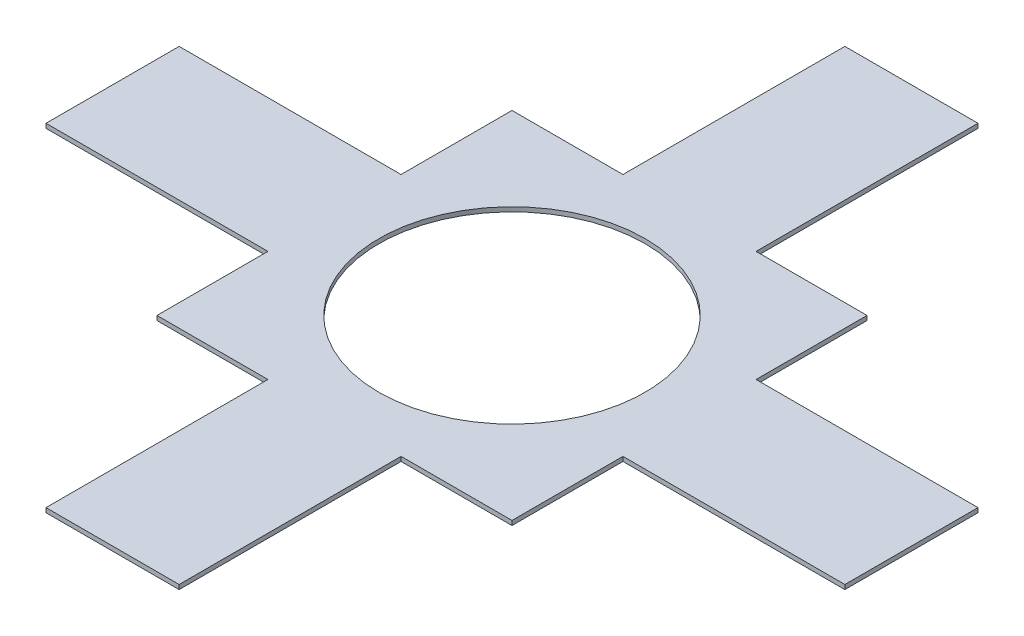
ISO-10303-21;
HEADER;
FILE_DESCRIPTION(('STEP AP214'),'2;1');
FILE_NAME('part.step','',(''),(''),'','','');
FILE_SCHEMA(('AUTOMOTIVE_DESIGN { 1 0 10303 214 1 1 1 1 }'));
ENDSEC;
DATA;
#1=APPLICATION_CONTEXT('core data for automotive mechanical design processes');
#2=APPLICATION_PROTOCOL_DEFINITION('international standard','automotive_design',2000,#1);
#3=PRODUCT_CONTEXT('',#1,'mechanical');
#4=PRODUCT('Part','Part','',(#3));
#5=PRODUCT_RELATED_PRODUCT_CATEGORY('part','',(#4));
#6=PRODUCT_DEFINITION_FORMATION('','',#4);
#7=PRODUCT_DEFINITION_CONTEXT('part definition',#1,'design');
#8=PRODUCT_DEFINITION('design','',#6,#7);
#9=PRODUCT_DEFINITION_SHAPE('','',#8);
#10=(LENGTH_UNIT() NAMED_UNIT(*) SI_UNIT(.MILLI.,.METRE.));
#11=(NAMED_UNIT(*) PLANE_ANGLE_UNIT() SI_UNIT($,.RADIAN.));
#12=(NAMED_UNIT(*) SI_UNIT($,.STERADIAN.) SOLID_ANGLE_UNIT());
#13=UNCERTAINTY_MEASURE_WITH_UNIT(LENGTH_MEASURE(1.E-05),#10,'distance_accuracy_value','');
#14=(GEOMETRIC_REPRESENTATION_CONTEXT(3) GLOBAL_UNCERTAINTY_ASSIGNED_CONTEXT((#13)) GLOBAL_UNIT_ASSIGNED_CONTEXT((#10,
#11,#12)) REPRESENTATION_CONTEXT('',''));
#15=CARTESIAN_POINT('',(0.,0.,0.));
#16=DIRECTION('',(0.,0.,1.));
#17=DIRECTION('',(1.,0.,0.));
#18=AXIS2_PLACEMENT_3D('',#15,#16,#17);
#19=CARTESIAN_POINT('',(0.,0.1,0.));
#20=DIRECTION('',(0.,1.,0.));
#21=DIRECTION('',(0.,0.,1.));
#22=AXIS2_PLACEMENT_3D('',#19,#20,#21);
#23=PLANE('',#22);
#24=DIRECTION('',(0.,0.,1.));
#25=VECTOR('',#24,1.);
#26=CARTESIAN_POINT('',(-3.99999999999913,0.1,-4.));
#27=LINE('',#26,#25);
#28=CARTESIAN_POINT('',(-3.99999999999913,0.1,-4.));
#29=VERTEX_POINT('',#28);
#30=CARTESIAN_POINT('',(-3.99999999999913,0.1,-1.50000000000023));
#31=VERTEX_POINT('',#30);
#32=EDGE_CURVE('E247',#29,#31,#27,.T.);
#33=ORIENTED_EDGE('',*,*,#32,.T.);
#34=DIRECTION('',(-1.,0.,0.));
#35=VECTOR('',#34,1.);
#36=CARTESIAN_POINT('',(-8.99999999999946,0.1,-1.50000000000022));
#37=LINE('',#36,#35);
#38=CARTESIAN_POINT('',(-8.99999999999946,0.1,-1.50000000000022));
#39=VERTEX_POINT('',#38);
#40=EDGE_CURVE('E135',#31,#39,#37,.T.);
#41=ORIENTED_EDGE('',*,*,#40,.T.);
#42=DIRECTION('',(0.,0.,1.));
#43=VECTOR('',#42,1.);
#44=CARTESIAN_POINT('',(-8.99999999999946,0.1,1.50000000000006));
#45=LINE('',#44,#43);
#46=CARTESIAN_POINT('',(-8.99999999999946,0.1,1.50000000000006));
#47=VERTEX_POINT('',#46);
#48=EDGE_CURVE('E298',#39,#47,#45,.T.);
#49=ORIENTED_EDGE('',*,*,#48,.T.);
#50=DIRECTION('',(1.,0.,0.));
#51=VECTOR('',#50,1.);
#52=CARTESIAN_POINT('',(-3.99999999999913,0.1,1.50000000000006));
#53=LINE('',#52,#51);
#54=CARTESIAN_POINT('',(-3.99999999999913,0.1,1.50000000000006));
#55=VERTEX_POINT('',#54);
#56=EDGE_CURVE('E317',#47,#55,#53,.T.);
#57=ORIENTED_EDGE('',*,*,#56,.T.);
#58=DIRECTION('',(0.,0.,1.));
#59=VECTOR('',#58,1.);
#60=CARTESIAN_POINT('',(-3.99999999999913,0.1,1.50000000000006));
#61=LINE('',#60,#59);
#62=CARTESIAN_POINT('',(-3.99999999999913,0.1,3.99999999999981));
#63=VERTEX_POINT('',#62);
#64=EDGE_CURVE('E314',#55,#63,#61,.T.);
#65=ORIENTED_EDGE('',*,*,#64,.T.);
#66=DIRECTION('',(1.,0.,0.));
#67=VECTOR('',#66,1.);
#68=CARTESIAN_POINT('',(-3.99999999999913,0.1,3.99999999999981));
#69=LINE('',#68,#67);
#70=CARTESIAN_POINT('',(-1.49999999999921,0.1,3.99999999999971));
#71=VERTEX_POINT('',#70);
#72=EDGE_CURVE('E316',#63,#71,#69,.T.);
#73=ORIENTED_EDGE('',*,*,#72,.T.);
#74=DIRECTION('',(0.,0.,1.));
#75=VECTOR('',#74,1.);
#76=CARTESIAN_POINT('',(-1.49999999999921,0.1,8.99999999999753));
#77=LINE('',#76,#75);
#78=CARTESIAN_POINT('',(-1.49999999999921,0.1,8.99999999999753));
#79=VERTEX_POINT('',#78);
#80=EDGE_CURVE('E319',#71,#79,#77,.T.);
#81=ORIENTED_EDGE('',*,*,#80,.T.);
#82=DIRECTION('',(1.,0.,0.));
#83=VECTOR('',#82,1.);
#84=CARTESIAN_POINT('',(1.5000000000008,0.1,8.9999999999976));
#85=LINE('',#84,#83);
#86=CARTESIAN_POINT('',(1.5000000000008,0.1,8.9999999999976));
#87=VERTEX_POINT('',#86);
#88=EDGE_CURVE('E325',#79,#87,#85,.T.);
#89=ORIENTED_EDGE('',*,*,#88,.T.);
#90=DIRECTION('',(0.,0.,-1.));
#91=VECTOR('',#90,1.);
#92=CARTESIAN_POINT('',(1.50000000000079,0.1,3.99999999999971));
#93=LINE('',#92,#91);
#94=CARTESIAN_POINT('',(1.50000000000079,0.1,3.99999999999971));
#95=VERTEX_POINT('',#94);
#96=EDGE_CURVE('E327',#87,#95,#93,.T.);
#97=ORIENTED_EDGE('',*,*,#96,.T.);
#98=DIRECTION('',(1.,0.,0.));
#99=VECTOR('',#98,1.);
#100=CARTESIAN_POINT('',(1.50000000000079,0.1,3.99999999999971));
#101=LINE('',#100,#99);
#102=CARTESIAN_POINT('',(4.00000000000025,0.1,3.99999999999981));
#103=VERTEX_POINT('',#102);
#104=EDGE_CURVE('E329',#95,#103,#101,.T.);
#105=ORIENTED_EDGE('',*,*,#104,.T.);
#106=DIRECTION('',(0.,0.,-1.));
#107=VECTOR('',#106,1.);
#108=CARTESIAN_POINT('',(4.00000000000025,0.1,1.50000000000082));
#109=LINE('',#108,#107);
#110=CARTESIAN_POINT('',(4.00000000000025,0.1,1.50000000000082));
#111=VERTEX_POINT('',#110);
#112=EDGE_CURVE('E331',#103,#111,#109,.T.);
#113=ORIENTED_EDGE('',*,*,#112,.T.);
#114=DIRECTION('',(1.,0.,0.));
#115=VECTOR('',#114,1.);
#116=CARTESIAN_POINT('',(9.00000000000025,0.1,1.50000000000082));
#117=LINE('',#116,#115);
#118=CARTESIAN_POINT('',(9.00000000000025,0.1,1.50000000000082));
#119=VERTEX_POINT('',#118);
#120=EDGE_CURVE('E333',#111,#119,#117,.T.);
#121=ORIENTED_EDGE('',*,*,#120,.T.);
#122=DIRECTION('',(0.,0.,-1.));
#123=VECTOR('',#122,1.);
#124=CARTESIAN_POINT('',(9.00000000000025,0.1,-1.50000000000052));
#125=LINE('',#124,#123);
#126=CARTESIAN_POINT('',(9.00000000000025,0.1,-1.50000000000052));
#127=VERTEX_POINT('',#126);
#128=EDGE_CURVE('E335',#119,#127,#125,.T.);
#129=ORIENTED_EDGE('',*,*,#128,.T.);
#130=DIRECTION('',(-1.,0.,0.));
#131=VECTOR('',#130,1.);
#132=CARTESIAN_POINT('',(4.00000000000025,0.1,-1.50000000000054));
#133=LINE('',#132,#131);
#134=CARTESIAN_POINT('',(4.00000000000025,0.1,-1.50000000000054));
#135=VERTEX_POINT('',#134);
#136=EDGE_CURVE('E337',#127,#135,#133,.T.);
#137=ORIENTED_EDGE('',*,*,#136,.T.);
#138=DIRECTION('',(0.,0.,-1.));
#139=VECTOR('',#138,1.);
#140=CARTESIAN_POINT('',(4.00000000000025,0.1,-4.));
#141=LINE('',#140,#139);
#142=CARTESIAN_POINT('',(4.00000000000025,0.1,-4.));
#143=VERTEX_POINT('',#142);
#144=EDGE_CURVE('E339',#135,#143,#141,.T.);
#145=ORIENTED_EDGE('',*,*,#144,.T.);
#146=DIRECTION('',(-1.,0.,0.));
#147=VECTOR('',#146,1.);
#148=CARTESIAN_POINT('',(1.50000000000087,0.1,-4.));
#149=LINE('',#148,#147);
#150=CARTESIAN_POINT('',(1.50000000000087,0.1,-4.));
#151=VERTEX_POINT('',#150);
#152=EDGE_CURVE('E341',#143,#151,#149,.T.);
#153=ORIENTED_EDGE('',*,*,#152,.T.);
#154=DIRECTION('',(0.,0.,-1.));
#155=VECTOR('',#154,1.);
#156=CARTESIAN_POINT('',(1.50000000000087,0.1,-9.));
#157=LINE('',#156,#155);
#158=CARTESIAN_POINT('',(1.50000000000087,0.1,-9.));
#159=VERTEX_POINT('',#158);
#160=EDGE_CURVE('E190',#151,#159,#157,.T.);
#161=ORIENTED_EDGE('',*,*,#160,.T.);
#162=DIRECTION('',(-1.,0.,0.));
#163=VECTOR('',#162,1.);
#164=CARTESIAN_POINT('',(-1.49999999999913,0.1,-9.));
#165=LINE('',#164,#163);
#166=CARTESIAN_POINT('',(-1.49999999999913,0.1,-9.));
#167=VERTEX_POINT('',#166);
#168=EDGE_CURVE('E184',#159,#167,#165,.T.);
#169=ORIENTED_EDGE('',*,*,#168,.T.);
#170=DIRECTION('',(0.,0.,1.));
#171=VECTOR('',#170,1.);
#172=CARTESIAN_POINT('',(-1.49999999999913,0.1,-4.));
#173=LINE('',#172,#171);
#174=CARTESIAN_POINT('',(-1.49999999999913,0.1,-4.));
#175=VERTEX_POINT('',#174);
#176=EDGE_CURVE('E188',#167,#175,#173,.T.);
#177=ORIENTED_EDGE('',*,*,#176,.T.);
#178=DIRECTION('',(-1.,0.,0.));
#179=VECTOR('',#178,1.);
#180=CARTESIAN_POINT('',(-3.99999999999913,0.1,-4.));
#181=LINE('',#180,#179);
#182=EDGE_CURVE('E56',#175,#29,#181,.T.);
#183=ORIENTED_EDGE('',*,*,#182,.T.);
#184=EDGE_LOOP('',(#33,#41,#49,#57,#65,#73,#81,#89,#97,#105,#113,#121,#129,#137,#145,#153,#161,
#169,#177,#183));
#185=FACE_BOUND('',#184,.T.);
#186=CARTESIAN_POINT('',(0.,0.1,0.));
#187=DIRECTION('',(0.,1.,0.));
#188=DIRECTION('',(0.,0.,1.));
#189=AXIS2_PLACEMENT_3D('',#186,#187,#188);
#190=CIRCLE('',#189,3.);
#191=CARTESIAN_POINT('',(0.,0.1,3.));
#192=VERTEX_POINT('',#191);
#193=EDGE_CURVE('E212',#192,#192,#190,.T.);
#194=ORIENTED_EDGE('',*,*,#193,.F.);
#195=EDGE_LOOP('',(#194));
#196=FACE_BOUND('',#195,.T.);
#197=ADVANCED_FACE('F39',(#185,#196),#23,.T.);
#198=CARTESIAN_POINT('',(0.,0.,0.));
#199=DIRECTION('',(0.,1.,0.));
#200=DIRECTION('',(0.,0.,1.));
#201=AXIS2_PLACEMENT_3D('',#198,#199,#200);
#202=PLANE('',#201);
#203=DIRECTION('',(0.,0.,1.));
#204=VECTOR('',#203,1.);
#205=CARTESIAN_POINT('',(-3.99999999999913,0.,-4.));
#206=LINE('',#205,#204);
#207=CARTESIAN_POINT('',(-3.99999999999913,0.,-4.));
#208=VERTEX_POINT('',#207);
#209=CARTESIAN_POINT('',(-3.99999999999913,0.,-1.50000000000023));
#210=VERTEX_POINT('',#209);
#211=EDGE_CURVE('E208',#208,#210,#206,.T.);
#212=ORIENTED_EDGE('',*,*,#211,.F.);
#213=DIRECTION('',(-1.,0.,0.));
#214=VECTOR('',#213,1.);
#215=CARTESIAN_POINT('',(-3.99999999999913,0.,-4.));
#216=LINE('',#215,#214);
#217=CARTESIAN_POINT('',(-1.49999999999913,0.,-4.));
#218=VERTEX_POINT('',#217);
#219=EDGE_CURVE('E127',#218,#208,#216,.T.);
#220=ORIENTED_EDGE('',*,*,#219,.F.);
#221=DIRECTION('',(0.,0.,1.));
#222=VECTOR('',#221,1.);
#223=CARTESIAN_POINT('',(-1.49999999999913,0.,-4.));
#224=LINE('',#223,#222);
#225=CARTESIAN_POINT('',(-1.49999999999913,0.,-9.));
#226=VERTEX_POINT('',#225);
#227=EDGE_CURVE('E121',#226,#218,#224,.T.);
#228=ORIENTED_EDGE('',*,*,#227,.F.);
#229=DIRECTION('',(-1.,0.,0.));
#230=VECTOR('',#229,1.);
#231=CARTESIAN_POINT('',(-1.49999999999913,0.,-9.));
#232=LINE('',#231,#230);
#233=CARTESIAN_POINT('',(1.50000000000087,0.,-9.));
#234=VERTEX_POINT('',#233);
#235=EDGE_CURVE('E198',#234,#226,#232,.T.);
#236=ORIENTED_EDGE('',*,*,#235,.F.);
#237=DIRECTION('',(0.,0.,-1.));
#238=VECTOR('',#237,1.);
#239=CARTESIAN_POINT('',(1.50000000000087,0.,-9.));
#240=LINE('',#239,#238);
#241=CARTESIAN_POINT('',(1.50000000000087,0.,-4.));
#242=VERTEX_POINT('',#241);
#243=EDGE_CURVE('E242',#242,#234,#240,.T.);
#244=ORIENTED_EDGE('',*,*,#243,.F.);
#245=DIRECTION('',(-1.,0.,0.));
#246=VECTOR('',#245,1.);
#247=CARTESIAN_POINT('',(1.50000000000087,0.,-4.));
#248=LINE('',#247,#246);
#249=CARTESIAN_POINT('',(4.00000000000025,0.,-4.));
#250=VERTEX_POINT('',#249);
#251=EDGE_CURVE('E240',#250,#242,#248,.T.);
#252=ORIENTED_EDGE('',*,*,#251,.F.);
#253=DIRECTION('',(0.,0.,-1.));
#254=VECTOR('',#253,1.);
#255=CARTESIAN_POINT('',(4.00000000000025,0.,-4.));
#256=LINE('',#255,#254);
#257=CARTESIAN_POINT('',(4.00000000000025,0.,-1.50000000000054));
#258=VERTEX_POINT('',#257);
#259=EDGE_CURVE('E238',#258,#250,#256,.T.);
#260=ORIENTED_EDGE('',*,*,#259,.F.);
#261=DIRECTION('',(-1.,0.,0.));
#262=VECTOR('',#261,1.);
#263=CARTESIAN_POINT('',(4.00000000000025,0.,-1.50000000000054));
#264=LINE('',#263,#262);
#265=CARTESIAN_POINT('',(9.00000000000025,0.,-1.50000000000052));
#266=VERTEX_POINT('',#265);
#267=EDGE_CURVE('E236',#266,#258,#264,.T.);
#268=ORIENTED_EDGE('',*,*,#267,.F.);
#269=DIRECTION('',(0.,0.,-1.));
#270=VECTOR('',#269,1.);
#271=CARTESIAN_POINT('',(9.00000000000025,0.,-1.50000000000052));
#272=LINE('',#271,#270);
#273=CARTESIAN_POINT('',(9.00000000000025,0.,1.50000000000082));
#274=VERTEX_POINT('',#273);
#275=EDGE_CURVE('E234',#274,#266,#272,.T.);
#276=ORIENTED_EDGE('',*,*,#275,.F.);
#277=DIRECTION('',(1.,0.,0.));
#278=VECTOR('',#277,1.);
#279=CARTESIAN_POINT('',(9.00000000000025,0.,1.50000000000082));
#280=LINE('',#279,#278);
#281=CARTESIAN_POINT('',(4.00000000000025,0.,1.50000000000082));
#282=VERTEX_POINT('',#281);
#283=EDGE_CURVE('E232',#282,#274,#280,.T.);
#284=ORIENTED_EDGE('',*,*,#283,.F.);
#285=DIRECTION('',(0.,0.,-1.));
#286=VECTOR('',#285,1.);
#287=CARTESIAN_POINT('',(4.00000000000025,0.,1.50000000000082));
#288=LINE('',#287,#286);
#289=CARTESIAN_POINT('',(4.00000000000025,0.,3.99999999999981));
#290=VERTEX_POINT('',#289);
#291=EDGE_CURVE('E230',#290,#282,#288,.T.);
#292=ORIENTED_EDGE('',*,*,#291,.F.);
#293=DIRECTION('',(1.,0.,0.));
#294=VECTOR('',#293,1.);
#295=CARTESIAN_POINT('',(1.50000000000079,0.,3.99999999999971));
#296=LINE('',#295,#294);
#297=CARTESIAN_POINT('',(1.50000000000079,0.,3.99999999999971));
#298=VERTEX_POINT('',#297);
#299=EDGE_CURVE('E228',#298,#290,#296,.T.);
#300=ORIENTED_EDGE('',*,*,#299,.F.);
#301=DIRECTION('',(0.,0.,-1.));
#302=VECTOR('',#301,1.);
#303=CARTESIAN_POINT('',(1.50000000000079,0.,3.99999999999971));
#304=LINE('',#303,#302);
#305=CARTESIAN_POINT('',(1.5000000000008,0.,8.9999999999976));
#306=VERTEX_POINT('',#305);
#307=EDGE_CURVE('E226',#306,#298,#304,.T.);
#308=ORIENTED_EDGE('',*,*,#307,.F.);
#309=DIRECTION('',(1.,0.,0.));
#310=VECTOR('',#309,1.);
#311=CARTESIAN_POINT('',(1.5000000000008,0.,8.9999999999976));
#312=LINE('',#311,#310);
#313=CARTESIAN_POINT('',(-1.49999999999921,0.,8.99999999999753));
#314=VERTEX_POINT('',#313);
#315=EDGE_CURVE('E224',#314,#306,#312,.T.);
#316=ORIENTED_EDGE('',*,*,#315,.F.);
#317=DIRECTION('',(0.,0.,1.));
#318=VECTOR('',#317,1.);
#319=CARTESIAN_POINT('',(-1.49999999999921,0.,8.99999999999753));
#320=LINE('',#319,#318);
#321=CARTESIAN_POINT('',(-1.49999999999921,0.,3.99999999999971));
#322=VERTEX_POINT('',#321);
#323=EDGE_CURVE('E222',#322,#314,#320,.T.);
#324=ORIENTED_EDGE('',*,*,#323,.F.);
#325=DIRECTION('',(1.,0.,0.));
#326=VECTOR('',#325,1.);
#327=CARTESIAN_POINT('',(-3.99999999999913,0.,3.99999999999981));
#328=LINE('',#327,#326);
#329=CARTESIAN_POINT('',(-3.99999999999913,0.,3.99999999999981));
#330=VERTEX_POINT('',#329);
#331=EDGE_CURVE('E220',#330,#322,#328,.T.);
#332=ORIENTED_EDGE('',*,*,#331,.F.);
#333=DIRECTION('',(0.,0.,1.));
#334=VECTOR('',#333,1.);
#335=CARTESIAN_POINT('',(-3.99999999999913,0.,1.50000000000006));
#336=LINE('',#335,#334);
#337=CARTESIAN_POINT('',(-3.99999999999913,0.,1.50000000000006));
#338=VERTEX_POINT('',#337);
#339=EDGE_CURVE('E218',#338,#330,#336,.T.);
#340=ORIENTED_EDGE('',*,*,#339,.F.);
#341=DIRECTION('',(1.,0.,0.));
#342=VECTOR('',#341,1.);
#343=CARTESIAN_POINT('',(-3.99999999999913,0.,1.50000000000006));
#344=LINE('',#343,#342);
#345=CARTESIAN_POINT('',(-8.99999999999946,0.,1.50000000000006));
#346=VERTEX_POINT('',#345);
#347=EDGE_CURVE('E216',#346,#338,#344,.T.);
#348=ORIENTED_EDGE('',*,*,#347,.F.);
#349=DIRECTION('',(0.,0.,1.));
#350=VECTOR('',#349,1.);
#351=CARTESIAN_POINT('',(-8.99999999999946,0.,1.50000000000006));
#352=LINE('',#351,#350);
#353=CARTESIAN_POINT('',(-8.99999999999946,0.,-1.50000000000022));
#354=VERTEX_POINT('',#353);
#355=EDGE_CURVE('E214',#354,#346,#352,.T.);
#356=ORIENTED_EDGE('',*,*,#355,.F.);
#357=DIRECTION('',(-1.,0.,0.));
#358=VECTOR('',#357,1.);
#359=CARTESIAN_POINT('',(-8.99999999999946,0.,-1.50000000000022));
#360=LINE('',#359,#358);
#361=EDGE_CURVE('E211',#210,#354,#360,.T.);
#362=ORIENTED_EDGE('',*,*,#361,.F.);
#363=EDGE_LOOP('',(#212,#220,#228,#236,#244,#252,#260,#268,#276,#284,#292,#300,#308,#316,#324,
#332,#340,#348,#356,#362));
#364=FACE_BOUND('',#363,.T.);
#365=CARTESIAN_POINT('',(0.,0.,0.));
#366=DIRECTION('',(0.,1.,0.));
#367=DIRECTION('',(0.,0.,1.));
#368=AXIS2_PLACEMENT_3D('',#365,#366,#367);
#369=CIRCLE('',#368,3.);
#370=CARTESIAN_POINT('',(0.,0.,3.));
#371=VERTEX_POINT('',#370);
#372=EDGE_CURVE('E594',#371,#371,#369,.T.);
#373=ORIENTED_EDGE('',*,*,#372,.T.);
#374=EDGE_LOOP('',(#373));
#375=FACE_BOUND('',#374,.T.);
#376=ADVANCED_FACE('F302',(#364,#375),#202,.F.);
#377=CARTESIAN_POINT('',(-3.99999999999913,0.1,-4.));
#378=DIRECTION('',(1.,0.,0.));
#379=DIRECTION('',(0.,0.,-1.));
#380=AXIS2_PLACEMENT_3D('',#377,#378,#379);
#381=PLANE('',#380);
#382=ORIENTED_EDGE('',*,*,#211,.T.);
#383=DIRECTION('',(0.,-1.,0.));
#384=VECTOR('',#383,1.);
#385=CARTESIAN_POINT('',(-3.99999999999913,0.1,-1.50000000000023));
#386=LINE('',#385,#384);
#387=EDGE_CURVE('E11',#31,#210,#386,.T.);
#388=ORIENTED_EDGE('',*,*,#387,.F.);
#389=ORIENTED_EDGE('',*,*,#32,.F.);
#390=DIRECTION('',(0.,-1.,0.));
#391=VECTOR('',#390,1.);
#392=CARTESIAN_POINT('',(-3.99999999999913,0.1,-4.));
#393=LINE('',#392,#391);
#394=EDGE_CURVE('E204',#29,#208,#393,.T.);
#395=ORIENTED_EDGE('',*,*,#394,.T.);
#396=EDGE_LOOP('',(#382,#388,#389,#395));
#397=FACE_BOUND('',#396,.T.);
#398=ADVANCED_FACE('F41',(#397),#381,.F.);
#399=CARTESIAN_POINT('',(-8.99999999999946,0.1,-1.50000000000022));
#400=DIRECTION('',(0.,0.,1.));
#401=DIRECTION('',(1.,0.,0.));
#402=AXIS2_PLACEMENT_3D('',#399,#400,#401);
#403=PLANE('',#402);
#404=ORIENTED_EDGE('',*,*,#361,.T.);
#405=DIRECTION('',(0.,-1.,0.));
#406=VECTOR('',#405,1.);
#407=CARTESIAN_POINT('',(-8.99999999999946,0.1,-1.50000000000022));
#408=LINE('',#407,#406);
#409=EDGE_CURVE('E48',#39,#354,#408,.T.);
#410=ORIENTED_EDGE('',*,*,#409,.F.);
#411=ORIENTED_EDGE('',*,*,#40,.F.);
#412=ORIENTED_EDGE('',*,*,#387,.T.);
#413=EDGE_LOOP('',(#404,#410,#411,#412));
#414=FACE_BOUND('',#413,.T.);
#415=ADVANCED_FACE('F375',(#414),#403,.F.);
#416=CARTESIAN_POINT('',(-8.99999999999946,0.1,1.50000000000006));
#417=DIRECTION('',(1.,0.,0.));
#418=DIRECTION('',(0.,0.,-1.));
#419=AXIS2_PLACEMENT_3D('',#416,#417,#418);
#420=PLANE('',#419);
#421=ORIENTED_EDGE('',*,*,#355,.T.);
#422=DIRECTION('',(0.,-1.,0.));
#423=VECTOR('',#422,1.);
#424=CARTESIAN_POINT('',(-8.99999999999946,0.1,1.50000000000006));
#425=LINE('',#424,#423);
#426=EDGE_CURVE('E290',#47,#346,#425,.T.);
#427=ORIENTED_EDGE('',*,*,#426,.F.);
#428=ORIENTED_EDGE('',*,*,#48,.F.);
#429=ORIENTED_EDGE('',*,*,#409,.T.);
#430=EDGE_LOOP('',(#421,#427,#428,#429));
#431=FACE_BOUND('',#430,.T.);
#432=ADVANCED_FACE('F296',(#431),#420,.F.);
#433=CARTESIAN_POINT('',(-3.99999999999913,0.1,1.50000000000006));
#434=DIRECTION('',(0.,0.,-1.));
#435=DIRECTION('',(-1.,0.,0.));
#436=AXIS2_PLACEMENT_3D('',#433,#434,#435);
#437=PLANE('',#436);
#438=ORIENTED_EDGE('',*,*,#347,.T.);
#439=DIRECTION('',(0.,-1.,0.));
#440=VECTOR('',#439,1.);
#441=CARTESIAN_POINT('',(-3.99999999999913,0.1,1.50000000000006));
#442=LINE('',#441,#440);
#443=EDGE_CURVE('E287',#55,#338,#442,.T.);
#444=ORIENTED_EDGE('',*,*,#443,.F.);
#445=ORIENTED_EDGE('',*,*,#56,.F.);
#446=ORIENTED_EDGE('',*,*,#426,.T.);
#447=EDGE_LOOP('',(#438,#444,#445,#446));
#448=FACE_BOUND('',#447,.T.);
#449=ADVANCED_FACE('F308',(#448),#437,.F.);
#450=CARTESIAN_POINT('',(-3.99999999999913,0.1,1.50000000000006));
#451=DIRECTION('',(1.,0.,0.));
#452=DIRECTION('',(0.,0.,-1.));
#453=AXIS2_PLACEMENT_3D('',#450,#451,#452);
#454=PLANE('',#453);
#455=ORIENTED_EDGE('',*,*,#339,.T.);
#456=DIRECTION('',(0.,-1.,0.));
#457=VECTOR('',#456,1.);
#458=CARTESIAN_POINT('',(-3.99999999999913,0.1,3.99999999999981));
#459=LINE('',#458,#457);
#460=EDGE_CURVE('E284',#63,#330,#459,.T.);
#461=ORIENTED_EDGE('',*,*,#460,.F.);
#462=ORIENTED_EDGE('',*,*,#64,.F.);
#463=ORIENTED_EDGE('',*,*,#443,.T.);
#464=EDGE_LOOP('',(#455,#461,#462,#463));
#465=FACE_BOUND('',#464,.T.);
#466=ADVANCED_FACE('F312',(#465),#454,.F.);
#467=CARTESIAN_POINT('',(-3.99999999999913,0.1,3.99999999999981));
#468=DIRECTION('',(0.,0.,-1.));
#469=DIRECTION('',(-1.,0.,0.));
#470=AXIS2_PLACEMENT_3D('',#467,#468,#469);
#471=PLANE('',#470);
#472=ORIENTED_EDGE('',*,*,#331,.T.);
#473=DIRECTION('',(0.,-1.,0.));
#474=VECTOR('',#473,1.);
#475=CARTESIAN_POINT('',(-1.49999999999921,0.1,3.99999999999971));
#476=LINE('',#475,#474);
#477=EDGE_CURVE('E281',#71,#322,#476,.T.);
#478=ORIENTED_EDGE('',*,*,#477,.F.);
#479=ORIENTED_EDGE('',*,*,#72,.F.);
#480=ORIENTED_EDGE('',*,*,#460,.T.);
#481=EDGE_LOOP('',(#472,#478,#479,#480));
#482=FACE_BOUND('',#481,.T.);
#483=ADVANCED_FACE('F388',(#482),#471,.F.);
#484=CARTESIAN_POINT('',(-1.49999999999921,0.1,8.99999999999753));
#485=DIRECTION('',(1.,0.,0.));
#486=DIRECTION('',(0.,0.,-1.));
#487=AXIS2_PLACEMENT_3D('',#484,#485,#486);
#488=PLANE('',#487);
#489=ORIENTED_EDGE('',*,*,#323,.T.);
#490=DIRECTION('',(0.,-1.,0.));
#491=VECTOR('',#490,1.);
#492=CARTESIAN_POINT('',(-1.49999999999921,0.1,8.99999999999753));
#493=LINE('',#492,#491);
#494=EDGE_CURVE('E278',#79,#314,#493,.T.);
#495=ORIENTED_EDGE('',*,*,#494,.F.);
#496=ORIENTED_EDGE('',*,*,#80,.F.);
#497=ORIENTED_EDGE('',*,*,#477,.T.);
#498=EDGE_LOOP('',(#489,#495,#496,#497));
#499=FACE_BOUND('',#498,.T.);
#500=ADVANCED_FACE('F391',(#499),#488,.F.);
#501=CARTESIAN_POINT('',(1.5000000000008,0.1,8.9999999999976));
#502=DIRECTION('',(0.,0.,-1.));
#503=DIRECTION('',(-1.,0.,0.));
#504=AXIS2_PLACEMENT_3D('',#501,#502,#503);
#505=PLANE('',#504);
#506=ORIENTED_EDGE('',*,*,#315,.T.);
#507=DIRECTION('',(0.,-1.,0.));
#508=VECTOR('',#507,1.);
#509=CARTESIAN_POINT('',(1.5000000000008,0.1,8.9999999999976));
#510=LINE('',#509,#508);
#511=EDGE_CURVE('E275',#87,#306,#510,.T.);
#512=ORIENTED_EDGE('',*,*,#511,.F.);
#513=ORIENTED_EDGE('',*,*,#88,.F.);
#514=ORIENTED_EDGE('',*,*,#494,.T.);
#515=EDGE_LOOP('',(#506,#512,#513,#514));
#516=FACE_BOUND('',#515,.T.);
#517=ADVANCED_FACE('F395',(#516),#505,.F.);
#518=CARTESIAN_POINT('',(1.50000000000079,0.1,3.99999999999971));
#519=DIRECTION('',(-1.,0.,0.));
#520=DIRECTION('',(0.,0.,1.));
#521=AXIS2_PLACEMENT_3D('',#518,#519,#520);
#522=PLANE('',#521);
#523=ORIENTED_EDGE('',*,*,#307,.T.);
#524=DIRECTION('',(0.,-1.,0.));
#525=VECTOR('',#524,1.);
#526=CARTESIAN_POINT('',(1.50000000000079,0.1,3.99999999999971));
#527=LINE('',#526,#525);
#528=EDGE_CURVE('E272',#95,#298,#527,.T.);
#529=ORIENTED_EDGE('',*,*,#528,.F.);
#530=ORIENTED_EDGE('',*,*,#96,.F.);
#531=ORIENTED_EDGE('',*,*,#511,.T.);
#532=EDGE_LOOP('',(#523,#529,#530,#531));
#533=FACE_BOUND('',#532,.T.);
#534=ADVANCED_FACE('F399',(#533),#522,.F.);
#535=CARTESIAN_POINT('',(1.50000000000079,0.1,3.99999999999971));
#536=DIRECTION('',(0.,0.,-1.));
#537=DIRECTION('',(-1.,0.,0.));
#538=AXIS2_PLACEMENT_3D('',#535,#536,#537);
#539=PLANE('',#538);
#540=ORIENTED_EDGE('',*,*,#299,.T.);
#541=DIRECTION('',(0.,-1.,0.));
#542=VECTOR('',#541,1.);
#543=CARTESIAN_POINT('',(4.00000000000025,0.1,3.99999999999981));
#544=LINE('',#543,#542);
#545=EDGE_CURVE('E269',#103,#290,#544,.T.);
#546=ORIENTED_EDGE('',*,*,#545,.F.);
#547=ORIENTED_EDGE('',*,*,#104,.F.);
#548=ORIENTED_EDGE('',*,*,#528,.T.);
#549=EDGE_LOOP('',(#540,#546,#547,#548));
#550=FACE_BOUND('',#549,.T.);
#551=ADVANCED_FACE('F403',(#550),#539,.F.);
#552=CARTESIAN_POINT('',(4.00000000000025,0.1,1.50000000000082));
#553=DIRECTION('',(-1.,0.,0.));
#554=DIRECTION('',(0.,0.,1.));
#555=AXIS2_PLACEMENT_3D('',#552,#553,#554);
#556=PLANE('',#555);
#557=ORIENTED_EDGE('',*,*,#291,.T.);
#558=DIRECTION('',(0.,-1.,0.));
#559=VECTOR('',#558,1.);
#560=CARTESIAN_POINT('',(4.00000000000025,0.1,1.50000000000082));
#561=LINE('',#560,#559);
#562=EDGE_CURVE('E266',#111,#282,#561,.T.);
#563=ORIENTED_EDGE('',*,*,#562,.F.);
#564=ORIENTED_EDGE('',*,*,#112,.F.);
#565=ORIENTED_EDGE('',*,*,#545,.T.);
#566=EDGE_LOOP('',(#557,#563,#564,#565));
#567=FACE_BOUND('',#566,.T.);
#568=ADVANCED_FACE('F407',(#567),#556,.F.);
#569=CARTESIAN_POINT('',(9.00000000000025,0.1,1.50000000000082));
#570=DIRECTION('',(0.,0.,-1.));
#571=DIRECTION('',(-1.,0.,0.));
#572=AXIS2_PLACEMENT_3D('',#569,#570,#571);
#573=PLANE('',#572);
#574=ORIENTED_EDGE('',*,*,#283,.T.);
#575=DIRECTION('',(0.,-1.,0.));
#576=VECTOR('',#575,1.);
#577=CARTESIAN_POINT('',(9.00000000000025,0.1,1.50000000000082));
#578=LINE('',#577,#576);
#579=EDGE_CURVE('E263',#119,#274,#578,.T.);
#580=ORIENTED_EDGE('',*,*,#579,.F.);
#581=ORIENTED_EDGE('',*,*,#120,.F.);
#582=ORIENTED_EDGE('',*,*,#562,.T.);
#583=EDGE_LOOP('',(#574,#580,#581,#582));
#584=FACE_BOUND('',#583,.T.);
#585=ADVANCED_FACE('F411',(#584),#573,.F.);
#586=CARTESIAN_POINT('',(9.00000000000025,0.1,-1.50000000000052));
#587=DIRECTION('',(-1.,0.,0.));
#588=DIRECTION('',(0.,0.,1.));
#589=AXIS2_PLACEMENT_3D('',#586,#587,#588);
#590=PLANE('',#589);
#591=ORIENTED_EDGE('',*,*,#275,.T.);
#592=DIRECTION('',(0.,-1.,0.));
#593=VECTOR('',#592,1.);
#594=CARTESIAN_POINT('',(9.00000000000025,0.1,-1.50000000000052));
#595=LINE('',#594,#593);
#596=EDGE_CURVE('E260',#127,#266,#595,.T.);
#597=ORIENTED_EDGE('',*,*,#596,.F.);
#598=ORIENTED_EDGE('',*,*,#128,.F.);
#599=ORIENTED_EDGE('',*,*,#579,.T.);
#600=EDGE_LOOP('',(#591,#597,#598,#599));
#601=FACE_BOUND('',#600,.T.);
#602=ADVANCED_FACE('F415',(#601),#590,.F.);
#603=CARTESIAN_POINT('',(4.00000000000025,0.1,-1.50000000000054));
#604=DIRECTION('',(0.,0.,1.));
#605=DIRECTION('',(1.,0.,0.));
#606=AXIS2_PLACEMENT_3D('',#603,#604,#605);
#607=PLANE('',#606);
#608=ORIENTED_EDGE('',*,*,#267,.T.);
#609=DIRECTION('',(0.,-1.,0.));
#610=VECTOR('',#609,1.);
#611=CARTESIAN_POINT('',(4.00000000000025,0.1,-1.50000000000054));
#612=LINE('',#611,#610);
#613=EDGE_CURVE('E257',#135,#258,#612,.T.);
#614=ORIENTED_EDGE('',*,*,#613,.F.);
#615=ORIENTED_EDGE('',*,*,#136,.F.);
#616=ORIENTED_EDGE('',*,*,#596,.T.);
#617=EDGE_LOOP('',(#608,#614,#615,#616));
#618=FACE_BOUND('',#617,.T.);
#619=ADVANCED_FACE('F419',(#618),#607,.F.);
#620=CARTESIAN_POINT('',(4.00000000000025,0.1,-4.));
#621=DIRECTION('',(-1.,0.,0.));
#622=DIRECTION('',(0.,0.,1.));
#623=AXIS2_PLACEMENT_3D('',#620,#621,#622);
#624=PLANE('',#623);
#625=ORIENTED_EDGE('',*,*,#259,.T.);
#626=DIRECTION('',(0.,-1.,0.));
#627=VECTOR('',#626,1.);
#628=CARTESIAN_POINT('',(4.00000000000025,0.1,-4.));
#629=LINE('',#628,#627);
#630=EDGE_CURVE('E254',#143,#250,#629,.T.);
#631=ORIENTED_EDGE('',*,*,#630,.F.);
#632=ORIENTED_EDGE('',*,*,#144,.F.);
#633=ORIENTED_EDGE('',*,*,#613,.T.);
#634=EDGE_LOOP('',(#625,#631,#632,#633));
#635=FACE_BOUND('',#634,.T.);
#636=ADVANCED_FACE('F423',(#635),#624,.F.);
#637=CARTESIAN_POINT('',(1.50000000000087,0.1,-4.));
#638=DIRECTION('',(0.,0.,1.));
#639=DIRECTION('',(1.,0.,0.));
#640=AXIS2_PLACEMENT_3D('',#637,#638,#639);
#641=PLANE('',#640);
#642=ORIENTED_EDGE('',*,*,#251,.T.);
#643=DIRECTION('',(0.,-1.,0.));
#644=VECTOR('',#643,1.);
#645=CARTESIAN_POINT('',(1.50000000000087,0.1,-4.));
#646=LINE('',#645,#644);
#647=EDGE_CURVE('E251',#151,#242,#646,.T.);
#648=ORIENTED_EDGE('',*,*,#647,.F.);
#649=ORIENTED_EDGE('',*,*,#152,.F.);
#650=ORIENTED_EDGE('',*,*,#630,.T.);
#651=EDGE_LOOP('',(#642,#648,#649,#650));
#652=FACE_BOUND('',#651,.T.);
#653=ADVANCED_FACE('F347',(#652),#641,.F.);
#654=CARTESIAN_POINT('',(1.50000000000087,0.1,-9.));
#655=DIRECTION('',(-1.,0.,0.));
#656=DIRECTION('',(0.,0.,1.));
#657=AXIS2_PLACEMENT_3D('',#654,#655,#656);
#658=PLANE('',#657);
#659=ORIENTED_EDGE('',*,*,#243,.T.);
#660=DIRECTION('',(0.,-1.,0.));
#661=VECTOR('',#660,1.);
#662=CARTESIAN_POINT('',(1.50000000000087,0.1,-9.));
#663=LINE('',#662,#661);
#664=EDGE_CURVE('E199',#159,#234,#663,.T.);
#665=ORIENTED_EDGE('',*,*,#664,.F.);
#666=ORIENTED_EDGE('',*,*,#160,.F.);
#667=ORIENTED_EDGE('',*,*,#647,.T.);
#668=EDGE_LOOP('',(#659,#665,#666,#667));
#669=FACE_BOUND('',#668,.T.);
#670=ADVANCED_FACE('F351',(#669),#658,.F.);
#671=CARTESIAN_POINT('',(-1.49999999999913,0.1,-9.));
#672=DIRECTION('',(0.,0.,1.));
#673=DIRECTION('',(1.,0.,0.));
#674=AXIS2_PLACEMENT_3D('',#671,#672,#673);
#675=PLANE('',#674);
#676=ORIENTED_EDGE('',*,*,#235,.T.);
#677=DIRECTION('',(0.,-1.,0.));
#678=VECTOR('',#677,1.);
#679=CARTESIAN_POINT('',(-1.49999999999913,0.1,-9.));
#680=LINE('',#679,#678);
#681=EDGE_CURVE('E195',#167,#226,#680,.T.);
#682=ORIENTED_EDGE('',*,*,#681,.F.);
#683=ORIENTED_EDGE('',*,*,#168,.F.);
#684=ORIENTED_EDGE('',*,*,#664,.T.);
#685=EDGE_LOOP('',(#676,#682,#683,#684));
#686=FACE_BOUND('',#685,.T.);
#687=ADVANCED_FACE('F196',(#686),#675,.F.);
#688=CARTESIAN_POINT('',(-1.49999999999913,0.1,-4.));
#689=DIRECTION('',(1.,0.,0.));
#690=DIRECTION('',(0.,0.,-1.));
#691=AXIS2_PLACEMENT_3D('',#688,#689,#690);
#692=PLANE('',#691);
#693=ORIENTED_EDGE('',*,*,#227,.T.);
#694=DIRECTION('',(0.,-1.,0.));
#695=VECTOR('',#694,1.);
#696=CARTESIAN_POINT('',(-1.49999999999913,0.1,-4.));
#697=LINE('',#696,#695);
#698=EDGE_CURVE('E200',#175,#218,#697,.T.);
#699=ORIENTED_EDGE('',*,*,#698,.F.);
#700=ORIENTED_EDGE('',*,*,#176,.F.);
#701=ORIENTED_EDGE('',*,*,#681,.T.);
#702=EDGE_LOOP('',(#693,#699,#700,#701));
#703=FACE_BOUND('',#702,.T.);
#704=ADVANCED_FACE('F202',(#703),#692,.F.);
#705=CARTESIAN_POINT('',(-3.99999999999913,0.1,-4.));
#706=DIRECTION('',(0.,0.,1.));
#707=DIRECTION('',(1.,0.,0.));
#708=AXIS2_PLACEMENT_3D('',#705,#706,#707);
#709=PLANE('',#708);
#710=ORIENTED_EDGE('',*,*,#219,.T.);
#711=ORIENTED_EDGE('',*,*,#394,.F.);
#712=ORIENTED_EDGE('',*,*,#182,.F.);
#713=ORIENTED_EDGE('',*,*,#698,.T.);
#714=EDGE_LOOP('',(#710,#711,#712,#713));
#715=FACE_BOUND('',#714,.T.);
#716=ADVANCED_FACE('F355',(#715),#709,.F.);
#717=CARTESIAN_POINT('',(0.,0.1,0.));
#718=DIRECTION('',(0.,-1.,0.));
#719=DIRECTION('',(0.,0.,-1.));
#720=AXIS2_PLACEMENT_3D('',#717,#718,#719);
#721=CYLINDRICAL_SURFACE('',#720,3.);
#722=ORIENTED_EDGE('',*,*,#193,.T.);
#723=EDGE_LOOP('',(#722));
#724=FACE_BOUND('',#723,.T.);
#725=ORIENTED_EDGE('',*,*,#372,.F.);
#726=EDGE_LOOP('',(#725));
#727=FACE_BOUND('',#726,.T.);
#728=ADVANCED_FACE('F357',(#724,#727),#721,.F.);
#729=CLOSED_SHELL('',(#197,#376,#398,#415,#432,#449,#466,#483,#500,#517,#534,#551,#568,#585,
#602,#619,#636,#653,#670,#687,#704,#716,#728));
#730=MANIFOLD_SOLID_BREP('B2',#729);
#731=ADVANCED_BREP_SHAPE_REPRESENTATION('',(#18,#730),#14);
#732=SHAPE_DEFINITION_REPRESENTATION(#9,#731);
ENDSEC;
END-ISO-10303-21;
